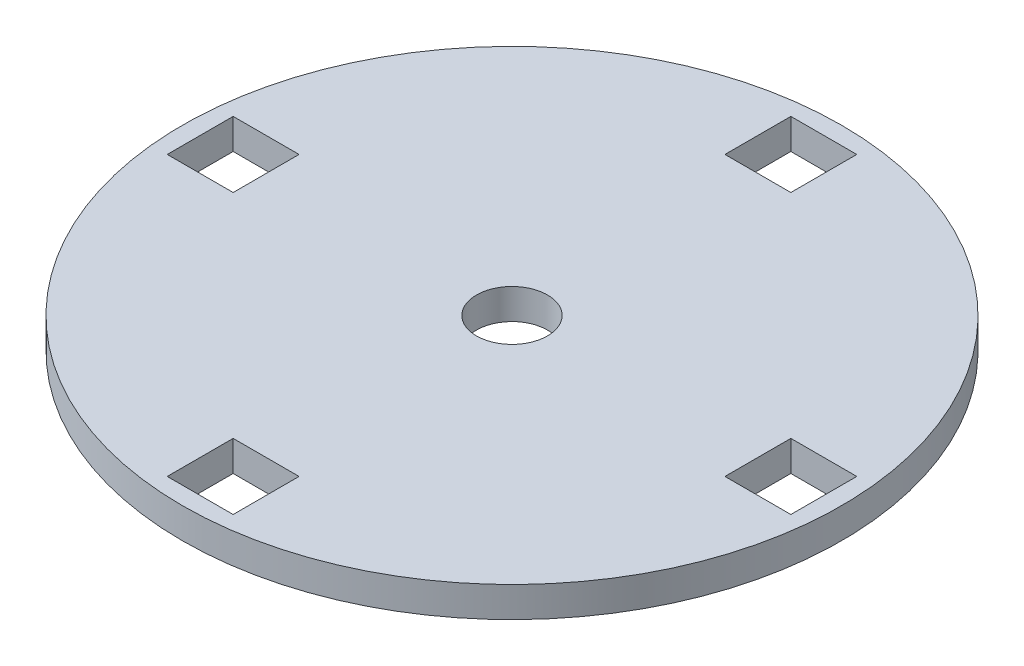
ISO-10303-21;
HEADER;
FILE_DESCRIPTION(('STEP AP214'),'2;1');
FILE_NAME('part.step','',(''),(''),'','','');
FILE_SCHEMA(('AUTOMOTIVE_DESIGN { 1 0 10303 214 1 1 1 1 }'));
ENDSEC;
DATA;
#1=APPLICATION_CONTEXT('core data for automotive mechanical design processes');
#2=APPLICATION_PROTOCOL_DEFINITION('international standard','automotive_design',2000,#1);
#3=PRODUCT_CONTEXT('',#1,'mechanical');
#4=PRODUCT('Part','Part','',(#3));
#5=PRODUCT_RELATED_PRODUCT_CATEGORY('part','',(#4));
#6=PRODUCT_DEFINITION_FORMATION('','',#4);
#7=PRODUCT_DEFINITION_CONTEXT('part definition',#1,'design');
#8=PRODUCT_DEFINITION('design','',#6,#7);
#9=PRODUCT_DEFINITION_SHAPE('','',#8);
#10=(LENGTH_UNIT() NAMED_UNIT(*) SI_UNIT(.MILLI.,.METRE.));
#11=(NAMED_UNIT(*) PLANE_ANGLE_UNIT() SI_UNIT($,.RADIAN.));
#12=(NAMED_UNIT(*) SI_UNIT($,.STERADIAN.) SOLID_ANGLE_UNIT());
#13=UNCERTAINTY_MEASURE_WITH_UNIT(LENGTH_MEASURE(1.E-05),#10,'distance_accuracy_value','');
#14=(GEOMETRIC_REPRESENTATION_CONTEXT(3) GLOBAL_UNCERTAINTY_ASSIGNED_CONTEXT((#13)) GLOBAL_UNIT_ASSIGNED_CONTEXT((#10,
#11,#12)) REPRESENTATION_CONTEXT('',''));
#15=CARTESIAN_POINT('',(0.,0.,0.));
#16=DIRECTION('',(0.,0.,1.));
#17=DIRECTION('',(1.,0.,0.));
#18=AXIS2_PLACEMENT_3D('',#15,#16,#17);
#19=CARTESIAN_POINT('',(0.,3.,0.));
#20=DIRECTION('',(0.,-1.,0.));
#21=DIRECTION('',(0.,0.,-1.));
#22=AXIS2_PLACEMENT_3D('',#19,#20,#21);
#23=CYLINDRICAL_SURFACE('',#22,32.5);
#24=CARTESIAN_POINT('',(0.,3.,0.));
#25=DIRECTION('',(0.,1.,0.));
#26=DIRECTION('',(0.,0.,1.));
#27=AXIS2_PLACEMENT_3D('',#24,#25,#26);
#28=CIRCLE('',#27,32.5);
#29=CARTESIAN_POINT('',(0.,3.,32.5));
#30=VERTEX_POINT('',#29);
#31=EDGE_CURVE('E220',#30,#30,#28,.T.);
#32=ORIENTED_EDGE('',*,*,#31,.F.);
#33=EDGE_LOOP('',(#32));
#34=FACE_BOUND('',#33,.T.);
#35=CARTESIAN_POINT('',(0.,0.,0.));
#36=DIRECTION('',(0.,1.,0.));
#37=DIRECTION('',(0.,0.,1.));
#38=AXIS2_PLACEMENT_3D('',#35,#36,#37);
#39=CIRCLE('',#38,32.5);
#40=CARTESIAN_POINT('',(0.,0.,32.5));
#41=VERTEX_POINT('',#40);
#42=EDGE_CURVE('E219',#41,#41,#39,.T.);
#43=ORIENTED_EDGE('',*,*,#42,.T.);
#44=EDGE_LOOP('',(#43));
#45=FACE_BOUND('',#44,.T.);
#46=ADVANCED_FACE('F50',(#34,#45),#23,.T.);
#47=CARTESIAN_POINT('',(0.,3.,0.));
#48=DIRECTION('',(0.,1.,0.));
#49=DIRECTION('',(0.,0.,1.));
#50=AXIS2_PLACEMENT_3D('',#47,#48,#49);
#51=PLANE('',#50);
#52=DIRECTION('',(0.,0.,-1.));
#53=VECTOR('',#52,1.);
#54=CARTESIAN_POINT('',(30.75,3.,0.));
#55=LINE('',#54,#53);
#56=CARTESIAN_POINT('',(30.75,3.,3.25));
#57=VERTEX_POINT('',#56);
#58=CARTESIAN_POINT('',(30.75,3.,-3.25));
#59=VERTEX_POINT('',#58);
#60=EDGE_CURVE('E217',#57,#59,#55,.T.);
#61=ORIENTED_EDGE('',*,*,#60,.F.);
#62=DIRECTION('',(1.,0.,0.));
#63=VECTOR('',#62,1.);
#64=CARTESIAN_POINT('',(0.,3.,3.25));
#65=LINE('',#64,#63);
#66=CARTESIAN_POINT('',(24.25,3.,3.25));
#67=VERTEX_POINT('',#66);
#68=EDGE_CURVE('E215',#67,#57,#65,.T.);
#69=ORIENTED_EDGE('',*,*,#68,.F.);
#70=DIRECTION('',(0.,0.,1.));
#71=VECTOR('',#70,1.);
#72=CARTESIAN_POINT('',(24.25,3.,0.));
#73=LINE('',#72,#71);
#74=CARTESIAN_POINT('',(24.25,3.,-3.25));
#75=VERTEX_POINT('',#74);
#76=EDGE_CURVE('E213',#75,#67,#73,.T.);
#77=ORIENTED_EDGE('',*,*,#76,.F.);
#78=DIRECTION('',(-1.,0.,0.));
#79=VECTOR('',#78,1.);
#80=CARTESIAN_POINT('',(0.,3.,-3.25));
#81=LINE('',#80,#79);
#82=EDGE_CURVE('E211',#59,#75,#81,.T.);
#83=ORIENTED_EDGE('',*,*,#82,.F.);
#84=EDGE_LOOP('',(#61,#69,#77,#83));
#85=FACE_BOUND('',#84,.T.);
#86=DIRECTION('',(0.,0.,-1.));
#87=VECTOR('',#86,1.);
#88=CARTESIAN_POINT('',(3.25,3.,0.));
#89=LINE('',#88,#87);
#90=CARTESIAN_POINT('',(3.25,3.,-24.25));
#91=VERTEX_POINT('',#90);
#92=CARTESIAN_POINT('',(3.24999999999999,3.,-30.75));
#93=VERTEX_POINT('',#92);
#94=EDGE_CURVE('E209',#91,#93,#89,.T.);
#95=ORIENTED_EDGE('',*,*,#94,.F.);
#96=DIRECTION('',(1.,0.,0.));
#97=VECTOR('',#96,1.);
#98=CARTESIAN_POINT('',(0.,3.,-24.25));
#99=LINE('',#98,#97);
#100=CARTESIAN_POINT('',(-3.25,3.,-24.25));
#101=VERTEX_POINT('',#100);
#102=EDGE_CURVE('E207',#101,#91,#99,.T.);
#103=ORIENTED_EDGE('',*,*,#102,.F.);
#104=DIRECTION('',(0.,0.,1.));
#105=VECTOR('',#104,1.);
#106=CARTESIAN_POINT('',(-3.25,3.,0.));
#107=LINE('',#106,#105);
#108=CARTESIAN_POINT('',(-3.25000000000001,3.,-30.75));
#109=VERTEX_POINT('',#108);
#110=EDGE_CURVE('E205',#109,#101,#107,.T.);
#111=ORIENTED_EDGE('',*,*,#110,.F.);
#112=DIRECTION('',(-1.,0.,0.));
#113=VECTOR('',#112,1.);
#114=CARTESIAN_POINT('',(0.,3.,-30.75));
#115=LINE('',#114,#113);
#116=EDGE_CURVE('E203',#93,#109,#115,.T.);
#117=ORIENTED_EDGE('',*,*,#116,.F.);
#118=EDGE_LOOP('',(#95,#103,#111,#117));
#119=FACE_BOUND('',#118,.T.);
#120=DIRECTION('',(-1.,0.,0.));
#121=VECTOR('',#120,1.);
#122=CARTESIAN_POINT('',(0.,3.,-3.25));
#123=LINE('',#122,#121);
#124=CARTESIAN_POINT('',(-24.25,3.,-3.25));
#125=VERTEX_POINT('',#124);
#126=CARTESIAN_POINT('',(-30.75,3.,-3.25));
#127=VERTEX_POINT('',#126);
#128=EDGE_CURVE('E200',#125,#127,#123,.T.);
#129=ORIENTED_EDGE('',*,*,#128,.F.);
#130=DIRECTION('',(0.,0.,-1.));
#131=VECTOR('',#130,1.);
#132=CARTESIAN_POINT('',(-24.25,3.,0.));
#133=LINE('',#132,#131);
#134=CARTESIAN_POINT('',(-24.25,3.,3.25));
#135=VERTEX_POINT('',#134);
#136=EDGE_CURVE('E198',#135,#125,#133,.T.);
#137=ORIENTED_EDGE('',*,*,#136,.F.);
#138=DIRECTION('',(1.,0.,0.));
#139=VECTOR('',#138,1.);
#140=CARTESIAN_POINT('',(0.,3.,3.25));
#141=LINE('',#140,#139);
#142=CARTESIAN_POINT('',(-30.75,3.,3.25));
#143=VERTEX_POINT('',#142);
#144=EDGE_CURVE('E196',#143,#135,#141,.T.);
#145=ORIENTED_EDGE('',*,*,#144,.F.);
#146=DIRECTION('',(0.,0.,1.));
#147=VECTOR('',#146,1.);
#148=CARTESIAN_POINT('',(-30.75,3.,0.));
#149=LINE('',#148,#147);
#150=EDGE_CURVE('E194',#127,#143,#149,.T.);
#151=ORIENTED_EDGE('',*,*,#150,.F.);
#152=EDGE_LOOP('',(#129,#137,#145,#151));
#153=FACE_BOUND('',#152,.T.);
#154=DIRECTION('',(0.,0.,1.));
#155=VECTOR('',#154,1.);
#156=CARTESIAN_POINT('',(-3.25,3.,0.));
#157=LINE('',#156,#155);
#158=CARTESIAN_POINT('',(-3.25,3.,24.25));
#159=VERTEX_POINT('',#158);
#160=CARTESIAN_POINT('',(-3.25,3.,30.75));
#161=VERTEX_POINT('',#160);
#162=EDGE_CURVE('E189',#159,#161,#157,.T.);
#163=ORIENTED_EDGE('',*,*,#162,.F.);
#164=DIRECTION('',(-1.,0.,0.));
#165=VECTOR('',#164,1.);
#166=CARTESIAN_POINT('',(0.,3.,24.25));
#167=LINE('',#166,#165);
#168=CARTESIAN_POINT('',(3.25,3.,24.25));
#169=VERTEX_POINT('',#168);
#170=EDGE_CURVE('E187',#169,#159,#167,.T.);
#171=ORIENTED_EDGE('',*,*,#170,.F.);
#172=DIRECTION('',(0.,0.,-1.));
#173=VECTOR('',#172,1.);
#174=CARTESIAN_POINT('',(3.25,3.,0.));
#175=LINE('',#174,#173);
#176=CARTESIAN_POINT('',(3.25,3.,30.75));
#177=VERTEX_POINT('',#176);
#178=EDGE_CURVE('E172',#177,#169,#175,.T.);
#179=ORIENTED_EDGE('',*,*,#178,.F.);
#180=DIRECTION('',(1.,0.,0.));
#181=VECTOR('',#180,1.);
#182=CARTESIAN_POINT('',(0.,3.,30.75));
#183=LINE('',#182,#181);
#184=EDGE_CURVE('E161',#161,#177,#183,.T.);
#185=ORIENTED_EDGE('',*,*,#184,.F.);
#186=EDGE_LOOP('',(#163,#171,#179,#185));
#187=FACE_BOUND('',#186,.T.);
#188=CARTESIAN_POINT('',(0.,3.,0.));
#189=DIRECTION('',(0.,1.,0.));
#190=DIRECTION('',(0.,0.,1.));
#191=AXIS2_PLACEMENT_3D('',#188,#189,#190);
#192=CIRCLE('',#191,3.5);
#193=CARTESIAN_POINT('',(0.,3.,3.5));
#194=VERTEX_POINT('',#193);
#195=EDGE_CURVE('E173',#194,#194,#192,.T.);
#196=ORIENTED_EDGE('',*,*,#195,.F.);
#197=EDGE_LOOP('',(#196));
#198=FACE_BOUND('',#197,.T.);
#199=ORIENTED_EDGE('',*,*,#31,.T.);
#200=EDGE_LOOP('',(#199));
#201=FACE_BOUND('',#200,.T.);
#202=ADVANCED_FACE('F185',(#85,#119,#153,#187,#198,#201),#51,.T.);
#203=CARTESIAN_POINT('',(0.,0.,0.));
#204=DIRECTION('',(0.,1.,0.));
#205=DIRECTION('',(0.,0.,1.));
#206=AXIS2_PLACEMENT_3D('',#203,#204,#205);
#207=PLANE('',#206);
#208=DIRECTION('',(1.,0.,0.));
#209=VECTOR('',#208,1.);
#210=CARTESIAN_POINT('',(0.,0.,3.25));
#211=LINE('',#210,#209);
#212=CARTESIAN_POINT('',(24.25,0.,3.25));
#213=VERTEX_POINT('',#212);
#214=CARTESIAN_POINT('',(30.75,0.,3.25));
#215=VERTEX_POINT('',#214);
#216=EDGE_CURVE('E57',#213,#215,#211,.T.);
#217=ORIENTED_EDGE('',*,*,#216,.T.);
#218=DIRECTION('',(0.,0.,-1.));
#219=VECTOR('',#218,1.);
#220=CARTESIAN_POINT('',(30.75,0.,0.));
#221=LINE('',#220,#219);
#222=CARTESIAN_POINT('',(30.75,0.,-3.25));
#223=VERTEX_POINT('',#222);
#224=EDGE_CURVE('E13',#215,#223,#221,.T.);
#225=ORIENTED_EDGE('',*,*,#224,.T.);
#226=DIRECTION('',(-1.,0.,0.));
#227=VECTOR('',#226,1.);
#228=CARTESIAN_POINT('',(0.,0.,-3.25));
#229=LINE('',#228,#227);
#230=CARTESIAN_POINT('',(24.25,0.,-3.25));
#231=VERTEX_POINT('',#230);
#232=EDGE_CURVE('E262',#223,#231,#229,.T.);
#233=ORIENTED_EDGE('',*,*,#232,.T.);
#234=DIRECTION('',(0.,0.,1.));
#235=VECTOR('',#234,1.);
#236=CARTESIAN_POINT('',(24.25,0.,0.));
#237=LINE('',#236,#235);
#238=EDGE_CURVE('E265',#231,#213,#237,.T.);
#239=ORIENTED_EDGE('',*,*,#238,.T.);
#240=EDGE_LOOP('',(#217,#225,#233,#239));
#241=FACE_BOUND('',#240,.T.);
#242=DIRECTION('',(1.,0.,0.));
#243=VECTOR('',#242,1.);
#244=CARTESIAN_POINT('',(0.,0.,-24.25));
#245=LINE('',#244,#243);
#246=CARTESIAN_POINT('',(-3.25,0.,-24.25));
#247=VERTEX_POINT('',#246);
#248=CARTESIAN_POINT('',(3.25,0.,-24.25));
#249=VERTEX_POINT('',#248);
#250=EDGE_CURVE('E256',#247,#249,#245,.T.);
#251=ORIENTED_EDGE('',*,*,#250,.T.);
#252=DIRECTION('',(0.,0.,-1.));
#253=VECTOR('',#252,1.);
#254=CARTESIAN_POINT('',(3.25,0.,0.));
#255=LINE('',#254,#253);
#256=CARTESIAN_POINT('',(3.24999999999999,0.,-30.75));
#257=VERTEX_POINT('',#256);
#258=EDGE_CURVE('E259',#249,#257,#255,.T.);
#259=ORIENTED_EDGE('',*,*,#258,.T.);
#260=DIRECTION('',(-1.,0.,0.));
#261=VECTOR('',#260,1.);
#262=CARTESIAN_POINT('',(0.,0.,-30.75));
#263=LINE('',#262,#261);
#264=CARTESIAN_POINT('',(-3.25000000000001,0.,-30.75));
#265=VERTEX_POINT('',#264);
#266=EDGE_CURVE('E250',#257,#265,#263,.T.);
#267=ORIENTED_EDGE('',*,*,#266,.T.);
#268=DIRECTION('',(0.,0.,1.));
#269=VECTOR('',#268,1.);
#270=CARTESIAN_POINT('',(-3.25,0.,0.));
#271=LINE('',#270,#269);
#272=EDGE_CURVE('E253',#265,#247,#271,.T.);
#273=ORIENTED_EDGE('',*,*,#272,.T.);
#274=EDGE_LOOP('',(#251,#259,#267,#273));
#275=FACE_BOUND('',#274,.T.);
#276=DIRECTION('',(0.,0.,-1.));
#277=VECTOR('',#276,1.);
#278=CARTESIAN_POINT('',(-24.25,0.,0.));
#279=LINE('',#278,#277);
#280=CARTESIAN_POINT('',(-24.25,0.,3.25));
#281=VERTEX_POINT('',#280);
#282=CARTESIAN_POINT('',(-24.25,0.,-3.25));
#283=VERTEX_POINT('',#282);
#284=EDGE_CURVE('E244',#281,#283,#279,.T.);
#285=ORIENTED_EDGE('',*,*,#284,.T.);
#286=DIRECTION('',(-1.,0.,0.));
#287=VECTOR('',#286,1.);
#288=CARTESIAN_POINT('',(0.,0.,-3.25));
#289=LINE('',#288,#287);
#290=CARTESIAN_POINT('',(-30.75,0.,-3.25));
#291=VERTEX_POINT('',#290);
#292=EDGE_CURVE('E247',#283,#291,#289,.T.);
#293=ORIENTED_EDGE('',*,*,#292,.T.);
#294=DIRECTION('',(0.,0.,1.));
#295=VECTOR('',#294,1.);
#296=CARTESIAN_POINT('',(-30.75,0.,0.));
#297=LINE('',#296,#295);
#298=CARTESIAN_POINT('',(-30.75,0.,3.25));
#299=VERTEX_POINT('',#298);
#300=EDGE_CURVE('E238',#291,#299,#297,.T.);
#301=ORIENTED_EDGE('',*,*,#300,.T.);
#302=DIRECTION('',(1.,0.,0.));
#303=VECTOR('',#302,1.);
#304=CARTESIAN_POINT('',(0.,0.,3.25));
#305=LINE('',#304,#303);
#306=EDGE_CURVE('E241',#299,#281,#305,.T.);
#307=ORIENTED_EDGE('',*,*,#306,.T.);
#308=EDGE_LOOP('',(#285,#293,#301,#307));
#309=FACE_BOUND('',#308,.T.);
#310=DIRECTION('',(-1.,0.,0.));
#311=VECTOR('',#310,1.);
#312=CARTESIAN_POINT('',(0.,0.,24.25));
#313=LINE('',#312,#311);
#314=CARTESIAN_POINT('',(3.25,0.,24.25));
#315=VERTEX_POINT('',#314);
#316=CARTESIAN_POINT('',(-3.25,0.,24.25));
#317=VERTEX_POINT('',#316);
#318=EDGE_CURVE('E232',#315,#317,#313,.T.);
#319=ORIENTED_EDGE('',*,*,#318,.T.);
#320=DIRECTION('',(0.,0.,1.));
#321=VECTOR('',#320,1.);
#322=CARTESIAN_POINT('',(-3.25,0.,0.));
#323=LINE('',#322,#321);
#324=CARTESIAN_POINT('',(-3.25,0.,30.75));
#325=VERTEX_POINT('',#324);
#326=EDGE_CURVE('E235',#317,#325,#323,.T.);
#327=ORIENTED_EDGE('',*,*,#326,.T.);
#328=DIRECTION('',(1.,0.,0.));
#329=VECTOR('',#328,1.);
#330=CARTESIAN_POINT('',(0.,0.,30.75));
#331=LINE('',#330,#329);
#332=CARTESIAN_POINT('',(3.25,0.,30.75));
#333=VERTEX_POINT('',#332);
#334=EDGE_CURVE('E223',#325,#333,#331,.T.);
#335=ORIENTED_EDGE('',*,*,#334,.T.);
#336=DIRECTION('',(0.,0.,-1.));
#337=VECTOR('',#336,1.);
#338=CARTESIAN_POINT('',(3.25,0.,0.));
#339=LINE('',#338,#337);
#340=EDGE_CURVE('E180',#333,#315,#339,.T.);
#341=ORIENTED_EDGE('',*,*,#340,.T.);
#342=EDGE_LOOP('',(#319,#327,#335,#341));
#343=FACE_BOUND('',#342,.T.);
#344=CARTESIAN_POINT('',(0.,0.,0.));
#345=DIRECTION('',(0.,1.,0.));
#346=DIRECTION('',(0.,0.,1.));
#347=AXIS2_PLACEMENT_3D('',#344,#345,#346);
#348=CIRCLE('',#347,3.5);
#349=CARTESIAN_POINT('',(0.,0.,3.5));
#350=VERTEX_POINT('',#349);
#351=EDGE_CURVE('E226',#350,#350,#348,.T.);
#352=ORIENTED_EDGE('',*,*,#351,.T.);
#353=EDGE_LOOP('',(#352));
#354=FACE_BOUND('',#353,.T.);
#355=ORIENTED_EDGE('',*,*,#42,.F.);
#356=EDGE_LOOP('',(#355));
#357=FACE_BOUND('',#356,.T.);
#358=ADVANCED_FACE('F269',(#241,#275,#309,#343,#354,#357),#207,.F.);
#359=CARTESIAN_POINT('',(0.,-1.2E-05,0.));
#360=DIRECTION('',(0.,1.,0.));
#361=DIRECTION('',(0.,0.,1.));
#362=AXIS2_PLACEMENT_3D('',#359,#360,#361);
#363=CYLINDRICAL_SURFACE('',#362,3.5);
#364=CARTESIAN_POINT('',(0.,3.,3.5));
#365=CARTESIAN_POINT('',(0.,2.96875,3.5));
#366=CARTESIAN_POINT('',(0.,2.9375,3.5));
#367=CARTESIAN_POINT('',(0.,2.875,3.5));
#368=CARTESIAN_POINT('',(0.,2.84375,3.5));
#369=CARTESIAN_POINT('',(0.,2.78125,3.5));
#370=CARTESIAN_POINT('',(0.,2.75,3.5));
#371=CARTESIAN_POINT('',(0.,2.6875,3.5));
#372=CARTESIAN_POINT('',(0.,2.65625,3.5));
#373=CARTESIAN_POINT('',(0.,2.59375,3.5));
#374=CARTESIAN_POINT('',(0.,2.5625,3.5));
#375=CARTESIAN_POINT('',(0.,2.5,3.5));
#376=CARTESIAN_POINT('',(0.,2.46875,3.5));
#377=CARTESIAN_POINT('',(0.,2.40625,3.5));
#378=CARTESIAN_POINT('',(0.,2.375,3.5));
#379=CARTESIAN_POINT('',(0.,2.3125,3.5));
#380=CARTESIAN_POINT('',(0.,2.28125,3.5));
#381=CARTESIAN_POINT('',(0.,2.21875,3.5));
#382=CARTESIAN_POINT('',(0.,2.1875,3.5));
#383=CARTESIAN_POINT('',(0.,2.125,3.5));
#384=CARTESIAN_POINT('',(0.,2.09375,3.5));
#385=CARTESIAN_POINT('',(0.,2.03125,3.5));
#386=CARTESIAN_POINT('',(0.,2.,3.5));
#387=CARTESIAN_POINT('',(0.,1.9375,3.5));
#388=CARTESIAN_POINT('',(0.,1.90625,3.5));
#389=CARTESIAN_POINT('',(0.,1.84375,3.5));
#390=CARTESIAN_POINT('',(0.,1.8125,3.5));
#391=CARTESIAN_POINT('',(0.,1.75,3.5));
#392=CARTESIAN_POINT('',(0.,1.71875,3.5));
#393=CARTESIAN_POINT('',(0.,1.65625,3.5));
#394=CARTESIAN_POINT('',(0.,1.625,3.5));
#395=CARTESIAN_POINT('',(0.,1.5625,3.5));
#396=CARTESIAN_POINT('',(0.,1.53125,3.5));
#397=CARTESIAN_POINT('',(0.,1.46875,3.5));
#398=CARTESIAN_POINT('',(0.,1.4375,3.5));
#399=CARTESIAN_POINT('',(0.,1.375,3.5));
#400=CARTESIAN_POINT('',(0.,1.34375,3.5));
#401=CARTESIAN_POINT('',(0.,1.28125,3.5));
#402=CARTESIAN_POINT('',(0.,1.25,3.5));
#403=CARTESIAN_POINT('',(0.,1.1875,3.5));
#404=CARTESIAN_POINT('',(0.,1.15625,3.5));
#405=CARTESIAN_POINT('',(0.,1.09375,3.5));
#406=CARTESIAN_POINT('',(0.,1.0625,3.5));
#407=CARTESIAN_POINT('',(0.,1.,3.5));
#408=CARTESIAN_POINT('',(0.,0.96875,3.5));
#409=CARTESIAN_POINT('',(0.,0.90625,3.5));
#410=CARTESIAN_POINT('',(0.,0.875,3.5));
#411=CARTESIAN_POINT('',(0.,0.8125,3.5));
#412=CARTESIAN_POINT('',(0.,0.78125,3.5));
#413=CARTESIAN_POINT('',(0.,0.71875,3.5));
#414=CARTESIAN_POINT('',(0.,0.6875,3.5));
#415=CARTESIAN_POINT('',(0.,0.625,3.5));
#416=CARTESIAN_POINT('',(0.,0.59375,3.5));
#417=CARTESIAN_POINT('',(0.,0.53125,3.5));
#418=CARTESIAN_POINT('',(0.,0.5,3.5));
#419=CARTESIAN_POINT('',(0.,0.4375,3.5));
#420=CARTESIAN_POINT('',(0.,0.40625,3.5));
#421=CARTESIAN_POINT('',(0.,0.34375,3.5));
#422=CARTESIAN_POINT('',(0.,0.3125,3.5));
#423=CARTESIAN_POINT('',(0.,0.25,3.5));
#424=CARTESIAN_POINT('',(0.,0.21875,3.5));
#425=CARTESIAN_POINT('',(0.,0.15625,3.5));
#426=CARTESIAN_POINT('',(0.,0.125,3.5));
#427=CARTESIAN_POINT('',(0.,0.0625000000000002,3.5));
#428=CARTESIAN_POINT('',(0.,0.0312500000000002,3.5));
#429=CARTESIAN_POINT('',(0.,0.,3.5));
#430=B_SPLINE_CURVE_WITH_KNOTS('',3,(#364,#365,#366,#367,#368,#369,#370,#371,#372,#373,#374,
#375,#376,#377,#378,#379,#380,#381,#382,#383,#384,#385,#386,#387,#388,#389,#390,#391,#392,#393,
#394,#395,#396,#397,#398,#399,#400,#401,#402,#403,#404,#405,#406,#407,#408,#409,#410,#411,#412,
#413,#414,#415,#416,#417,#418,#419,#420,#421,#422,#423,#424,#425,#426,#427,#428,#429),
.UNSPECIFIED.,.F.,.F.,(4,2,2,2,2,2,2,2,2,2,2,2,2,2,2,2,2,2,2,2,2,2,2,2,2,2,2,2,2,2,2,2,4),(0.,
0.0937500000000001,0.1875,0.28125,0.375,0.46875,0.5625,0.65625,0.75,0.84375,0.9375,1.03125,
1.125,1.21875,1.3125,1.40625,1.5,1.59375,1.6875,1.78125,1.875,1.96875,2.0625,2.15625,2.25,
2.34375,2.4375,2.53125,2.625,2.71875,2.8125,2.90625,3.),.UNSPECIFIED.);
#431=EDGE_CURVE('BSEAM318',#194,#350,#430,.T.);
#432=ORIENTED_EDGE('',*,*,#195,.T.);
#433=ORIENTED_EDGE('',*,*,#351,.F.);
#434=ORIENTED_EDGE('',*,*,#431,.T.);
#435=ORIENTED_EDGE('',*,*,#431,.F.);
#436=EDGE_LOOP('',(#432,#434,#433,#435));
#437=FACE_BOUND('',#436,.T.);
#438=ADVANCED_FACE('F318',(#437),#363,.F.);
#439=CARTESIAN_POINT('',(-3.25,-1.2E-05,24.25));
#440=DIRECTION('',(-1.,0.,0.));
#441=DIRECTION('',(0.,0.,1.));
#442=AXIS2_PLACEMENT_3D('',#439,#440,#441);
#443=PLANE('',#442);
#444=ORIENTED_EDGE('',*,*,#162,.T.);
#445=DIRECTION('',(0.,1.,0.));
#446=VECTOR('',#445,1.);
#447=CARTESIAN_POINT('',(-3.25,-1.2E-05,30.75));
#448=LINE('',#447,#446);
#449=EDGE_CURVE('E167',#325,#161,#448,.T.);
#450=ORIENTED_EDGE('',*,*,#449,.F.);
#451=ORIENTED_EDGE('',*,*,#326,.F.);
#452=DIRECTION('',(0.,1.,0.));
#453=VECTOR('',#452,1.);
#454=CARTESIAN_POINT('',(-3.25,-1.2E-05,24.25));
#455=LINE('',#454,#453);
#456=EDGE_CURVE('E290',#317,#159,#455,.T.);
#457=ORIENTED_EDGE('',*,*,#456,.T.);
#458=EDGE_LOOP('',(#444,#450,#451,#457));
#459=FACE_BOUND('',#458,.T.);
#460=ADVANCED_FACE('F334',(#459),#443,.F.);
#461=CARTESIAN_POINT('',(3.25,-1.2E-05,24.25));
#462=DIRECTION('',(0.,0.,-1.));
#463=DIRECTION('',(-1.,0.,0.));
#464=AXIS2_PLACEMENT_3D('',#461,#462,#463);
#465=PLANE('',#464);
#466=ORIENTED_EDGE('',*,*,#170,.T.);
#467=ORIENTED_EDGE('',*,*,#456,.F.);
#468=ORIENTED_EDGE('',*,*,#318,.F.);
#469=DIRECTION('',(0.,1.,0.));
#470=VECTOR('',#469,1.);
#471=CARTESIAN_POINT('',(3.25,-1.2E-05,24.25));
#472=LINE('',#471,#470);
#473=EDGE_CURVE('E182',#315,#169,#472,.T.);
#474=ORIENTED_EDGE('',*,*,#473,.T.);
#475=EDGE_LOOP('',(#466,#467,#468,#474));
#476=FACE_BOUND('',#475,.T.);
#477=ADVANCED_FACE('F339',(#476),#465,.F.);
#478=CARTESIAN_POINT('',(3.25,-1.2E-05,24.25));
#479=DIRECTION('',(1.,0.,0.));
#480=DIRECTION('',(0.,0.,-1.));
#481=AXIS2_PLACEMENT_3D('',#478,#479,#480);
#482=PLANE('',#481);
#483=ORIENTED_EDGE('',*,*,#178,.T.);
#484=ORIENTED_EDGE('',*,*,#473,.F.);
#485=ORIENTED_EDGE('',*,*,#340,.F.);
#486=DIRECTION('',(0.,1.,0.));
#487=VECTOR('',#486,1.);
#488=CARTESIAN_POINT('',(3.25,-1.2E-05,30.75));
#489=LINE('',#488,#487);
#490=EDGE_CURVE('E164',#333,#177,#489,.T.);
#491=ORIENTED_EDGE('',*,*,#490,.T.);
#492=EDGE_LOOP('',(#483,#484,#485,#491));
#493=FACE_BOUND('',#492,.T.);
#494=ADVANCED_FACE('F176',(#493),#482,.F.);
#495=CARTESIAN_POINT('',(3.25,-1.2E-05,30.75));
#496=DIRECTION('',(0.,0.,1.));
#497=DIRECTION('',(1.,0.,0.));
#498=AXIS2_PLACEMENT_3D('',#495,#496,#497);
#499=PLANE('',#498);
#500=ORIENTED_EDGE('',*,*,#184,.T.);
#501=ORIENTED_EDGE('',*,*,#490,.F.);
#502=ORIENTED_EDGE('',*,*,#334,.F.);
#503=ORIENTED_EDGE('',*,*,#449,.T.);
#504=EDGE_LOOP('',(#500,#501,#502,#503));
#505=FACE_BOUND('',#504,.T.);
#506=ADVANCED_FACE('F163',(#505),#499,.F.);
#507=CARTESIAN_POINT('',(-24.25,-1.2E-05,-3.25));
#508=DIRECTION('',(0.,0.,-1.));
#509=DIRECTION('',(-1.,0.,0.));
#510=AXIS2_PLACEMENT_3D('',#507,#508,#509);
#511=PLANE('',#510);
#512=ORIENTED_EDGE('',*,*,#128,.T.);
#513=DIRECTION('',(0.,1.,0.));
#514=VECTOR('',#513,1.);
#515=CARTESIAN_POINT('',(-30.75,-1.2E-05,-3.25));
#516=LINE('',#515,#514);
#517=EDGE_CURVE('E300',#291,#127,#516,.T.);
#518=ORIENTED_EDGE('',*,*,#517,.F.);
#519=ORIENTED_EDGE('',*,*,#292,.F.);
#520=DIRECTION('',(0.,1.,0.));
#521=VECTOR('',#520,1.);
#522=CARTESIAN_POINT('',(-24.25,-1.2E-05,-3.25));
#523=LINE('',#522,#521);
#524=EDGE_CURVE('E291',#283,#125,#523,.T.);
#525=ORIENTED_EDGE('',*,*,#524,.T.);
#526=EDGE_LOOP('',(#512,#518,#519,#525));
#527=FACE_BOUND('',#526,.T.);
#528=ADVANCED_FACE('F343',(#527),#511,.F.);
#529=CARTESIAN_POINT('',(-24.25,-1.2E-05,3.25));
#530=DIRECTION('',(1.,0.,0.));
#531=DIRECTION('',(0.,0.,-1.));
#532=AXIS2_PLACEMENT_3D('',#529,#530,#531);
#533=PLANE('',#532);
#534=ORIENTED_EDGE('',*,*,#136,.T.);
#535=ORIENTED_EDGE('',*,*,#524,.F.);
#536=ORIENTED_EDGE('',*,*,#284,.F.);
#537=DIRECTION('',(0.,1.,0.));
#538=VECTOR('',#537,1.);
#539=CARTESIAN_POINT('',(-24.25,-1.2E-05,3.25));
#540=LINE('',#539,#538);
#541=EDGE_CURVE('E294',#281,#135,#540,.T.);
#542=ORIENTED_EDGE('',*,*,#541,.T.);
#543=EDGE_LOOP('',(#534,#535,#536,#542));
#544=FACE_BOUND('',#543,.T.);
#545=ADVANCED_FACE('F368',(#544),#533,.F.);
#546=CARTESIAN_POINT('',(-24.25,-1.2E-05,3.25));
#547=DIRECTION('',(0.,0.,1.));
#548=DIRECTION('',(1.,0.,0.));
#549=AXIS2_PLACEMENT_3D('',#546,#547,#548);
#550=PLANE('',#549);
#551=ORIENTED_EDGE('',*,*,#144,.T.);
#552=ORIENTED_EDGE('',*,*,#541,.F.);
#553=ORIENTED_EDGE('',*,*,#306,.F.);
#554=DIRECTION('',(0.,1.,0.));
#555=VECTOR('',#554,1.);
#556=CARTESIAN_POINT('',(-30.75,-1.2E-05,3.25));
#557=LINE('',#556,#555);
#558=EDGE_CURVE('E297',#299,#143,#557,.T.);
#559=ORIENTED_EDGE('',*,*,#558,.T.);
#560=EDGE_LOOP('',(#551,#552,#553,#559));
#561=FACE_BOUND('',#560,.T.);
#562=ADVANCED_FACE('F372',(#561),#550,.F.);
#563=CARTESIAN_POINT('',(-30.75,-1.2E-05,3.25));
#564=DIRECTION('',(-1.,0.,0.));
#565=DIRECTION('',(0.,0.,1.));
#566=AXIS2_PLACEMENT_3D('',#563,#564,#565);
#567=PLANE('',#566);
#568=ORIENTED_EDGE('',*,*,#150,.T.);
#569=ORIENTED_EDGE('',*,*,#558,.F.);
#570=ORIENTED_EDGE('',*,*,#300,.F.);
#571=ORIENTED_EDGE('',*,*,#517,.T.);
#572=EDGE_LOOP('',(#568,#569,#570,#571));
#573=FACE_BOUND('',#572,.T.);
#574=ADVANCED_FACE('F353',(#573),#567,.F.);
#575=CARTESIAN_POINT('',(3.25,-1.2E-05,-24.25));
#576=DIRECTION('',(1.,0.,0.));
#577=DIRECTION('',(0.,0.,-1.));
#578=AXIS2_PLACEMENT_3D('',#575,#576,#577);
#579=PLANE('',#578);
#580=ORIENTED_EDGE('',*,*,#94,.T.);
#581=DIRECTION('',(0.,1.,0.));
#582=VECTOR('',#581,1.);
#583=CARTESIAN_POINT('',(3.24999999999999,-1.2E-05,-30.75));
#584=LINE('',#583,#582);
#585=EDGE_CURVE('E72',#257,#93,#584,.T.);
#586=ORIENTED_EDGE('',*,*,#585,.F.);
#587=ORIENTED_EDGE('',*,*,#258,.F.);
#588=DIRECTION('',(0.,1.,0.));
#589=VECTOR('',#588,1.);
#590=CARTESIAN_POINT('',(3.25,-1.2E-05,-24.25));
#591=LINE('',#590,#589);
#592=EDGE_CURVE('E302',#249,#91,#591,.T.);
#593=ORIENTED_EDGE('',*,*,#592,.T.);
#594=EDGE_LOOP('',(#580,#586,#587,#593));
#595=FACE_BOUND('',#594,.T.);
#596=ADVANCED_FACE('F349',(#595),#579,.F.);
#597=CARTESIAN_POINT('',(-3.25,-1.2E-05,-24.25));
#598=DIRECTION('',(0.,0.,1.));
#599=DIRECTION('',(1.,0.,0.));
#600=AXIS2_PLACEMENT_3D('',#597,#598,#599);
#601=PLANE('',#600);
#602=ORIENTED_EDGE('',*,*,#102,.T.);
#603=ORIENTED_EDGE('',*,*,#592,.F.);
#604=ORIENTED_EDGE('',*,*,#250,.F.);
#605=DIRECTION('',(0.,1.,0.));
#606=VECTOR('',#605,1.);
#607=CARTESIAN_POINT('',(-3.25,-1.2E-05,-24.25));
#608=LINE('',#607,#606);
#609=EDGE_CURVE('E305',#247,#101,#608,.T.);
#610=ORIENTED_EDGE('',*,*,#609,.T.);
#611=EDGE_LOOP('',(#602,#603,#604,#610));
#612=FACE_BOUND('',#611,.T.);
#613=ADVANCED_FACE('F352',(#612),#601,.F.);
#614=CARTESIAN_POINT('',(-3.25,-1.2E-05,-24.25));
#615=DIRECTION('',(-1.,0.,0.));
#616=DIRECTION('',(0.,0.,1.));
#617=AXIS2_PLACEMENT_3D('',#614,#615,#616);
#618=PLANE('',#617);
#619=ORIENTED_EDGE('',*,*,#110,.T.);
#620=ORIENTED_EDGE('',*,*,#609,.F.);
#621=ORIENTED_EDGE('',*,*,#272,.F.);
#622=DIRECTION('',(0.,1.,0.));
#623=VECTOR('',#622,1.);
#624=CARTESIAN_POINT('',(-3.25000000000001,-1.2E-05,-30.75));
#625=LINE('',#624,#623);
#626=EDGE_CURVE('E308',#265,#109,#625,.T.);
#627=ORIENTED_EDGE('',*,*,#626,.T.);
#628=EDGE_LOOP('',(#619,#620,#621,#627));
#629=FACE_BOUND('',#628,.T.);
#630=ADVANCED_FACE('F359',(#629),#618,.F.);
#631=CARTESIAN_POINT('',(-3.25000000000001,-1.2E-05,-30.75));
#632=DIRECTION('',(0.,0.,-1.));
#633=DIRECTION('',(-1.,0.,0.));
#634=AXIS2_PLACEMENT_3D('',#631,#632,#633);
#635=PLANE('',#634);
#636=ORIENTED_EDGE('',*,*,#116,.T.);
#637=ORIENTED_EDGE('',*,*,#626,.F.);
#638=ORIENTED_EDGE('',*,*,#266,.F.);
#639=ORIENTED_EDGE('',*,*,#585,.T.);
#640=EDGE_LOOP('',(#636,#637,#638,#639));
#641=FACE_BOUND('',#640,.T.);
#642=ADVANCED_FACE('F355',(#641),#635,.F.);
#643=CARTESIAN_POINT('',(30.75,-1.2E-05,-3.25));
#644=DIRECTION('',(1.,0.,0.));
#645=DIRECTION('',(0.,0.,-1.));
#646=AXIS2_PLACEMENT_3D('',#643,#644,#645);
#647=PLANE('',#646);
#648=ORIENTED_EDGE('',*,*,#60,.T.);
#649=DIRECTION('',(0.,1.,0.));
#650=VECTOR('',#649,1.);
#651=CARTESIAN_POINT('',(30.75,-1.2E-05,-3.25));
#652=LINE('',#651,#650);
#653=EDGE_CURVE('E64',#223,#59,#652,.T.);
#654=ORIENTED_EDGE('',*,*,#653,.F.);
#655=ORIENTED_EDGE('',*,*,#224,.F.);
#656=DIRECTION('',(0.,1.,0.));
#657=VECTOR('',#656,1.);
#658=CARTESIAN_POINT('',(30.75,-1.2E-05,3.25));
#659=LINE('',#658,#657);
#660=EDGE_CURVE('E229',#215,#57,#659,.T.);
#661=ORIENTED_EDGE('',*,*,#660,.T.);
#662=EDGE_LOOP('',(#648,#654,#655,#661));
#663=FACE_BOUND('',#662,.T.);
#664=ADVANCED_FACE('F358',(#663),#647,.F.);
#665=CARTESIAN_POINT('',(24.25,-1.2E-05,3.25));
#666=DIRECTION('',(0.,0.,1.));
#667=DIRECTION('',(1.,0.,0.));
#668=AXIS2_PLACEMENT_3D('',#665,#666,#667);
#669=PLANE('',#668);
#670=ORIENTED_EDGE('',*,*,#68,.T.);
#671=ORIENTED_EDGE('',*,*,#660,.F.);
#672=ORIENTED_EDGE('',*,*,#216,.F.);
#673=DIRECTION('',(0.,1.,0.));
#674=VECTOR('',#673,1.);
#675=CARTESIAN_POINT('',(24.25,-1.2E-05,3.25));
#676=LINE('',#675,#674);
#677=EDGE_CURVE('E277',#213,#67,#676,.T.);
#678=ORIENTED_EDGE('',*,*,#677,.T.);
#679=EDGE_LOOP('',(#670,#671,#672,#678));
#680=FACE_BOUND('',#679,.T.);
#681=ADVANCED_FACE('F276',(#680),#669,.F.);
#682=CARTESIAN_POINT('',(24.25,-1.2E-05,-3.25));
#683=DIRECTION('',(-1.,0.,0.));
#684=DIRECTION('',(0.,0.,1.));
#685=AXIS2_PLACEMENT_3D('',#682,#683,#684);
#686=PLANE('',#685);
#687=ORIENTED_EDGE('',*,*,#76,.T.);
#688=ORIENTED_EDGE('',*,*,#677,.F.);
#689=ORIENTED_EDGE('',*,*,#238,.F.);
#690=DIRECTION('',(0.,1.,0.));
#691=VECTOR('',#690,1.);
#692=CARTESIAN_POINT('',(24.25,-1.2E-05,-3.25));
#693=LINE('',#692,#691);
#694=EDGE_CURVE('E284',#231,#75,#693,.T.);
#695=ORIENTED_EDGE('',*,*,#694,.T.);
#696=EDGE_LOOP('',(#687,#688,#689,#695));
#697=FACE_BOUND('',#696,.T.);
#698=ADVANCED_FACE('F281',(#697),#686,.F.);
#699=CARTESIAN_POINT('',(24.25,-1.2E-05,-3.25));
#700=DIRECTION('',(0.,0.,-1.));
#701=DIRECTION('',(-1.,0.,0.));
#702=AXIS2_PLACEMENT_3D('',#699,#700,#701);
#703=PLANE('',#702);
#704=ORIENTED_EDGE('',*,*,#82,.T.);
#705=ORIENTED_EDGE('',*,*,#694,.F.);
#706=ORIENTED_EDGE('',*,*,#232,.F.);
#707=ORIENTED_EDGE('',*,*,#653,.T.);
#708=EDGE_LOOP('',(#704,#705,#706,#707));
#709=FACE_BOUND('',#708,.T.);
#710=ADVANCED_FACE('F383',(#709),#703,.F.);
#711=CLOSED_SHELL('',(#46,#202,#358,#438,#460,#477,#494,#506,#528,#545,#562,#574,#596,#613,#630,
#642,#664,#681,#698,#710));
#712=MANIFOLD_SOLID_BREP('B2',#711);
#713=ADVANCED_BREP_SHAPE_REPRESENTATION('',(#18,#712),#14);
#714=SHAPE_DEFINITION_REPRESENTATION(#9,#713);
ENDSEC;
END-ISO-10303-21;
